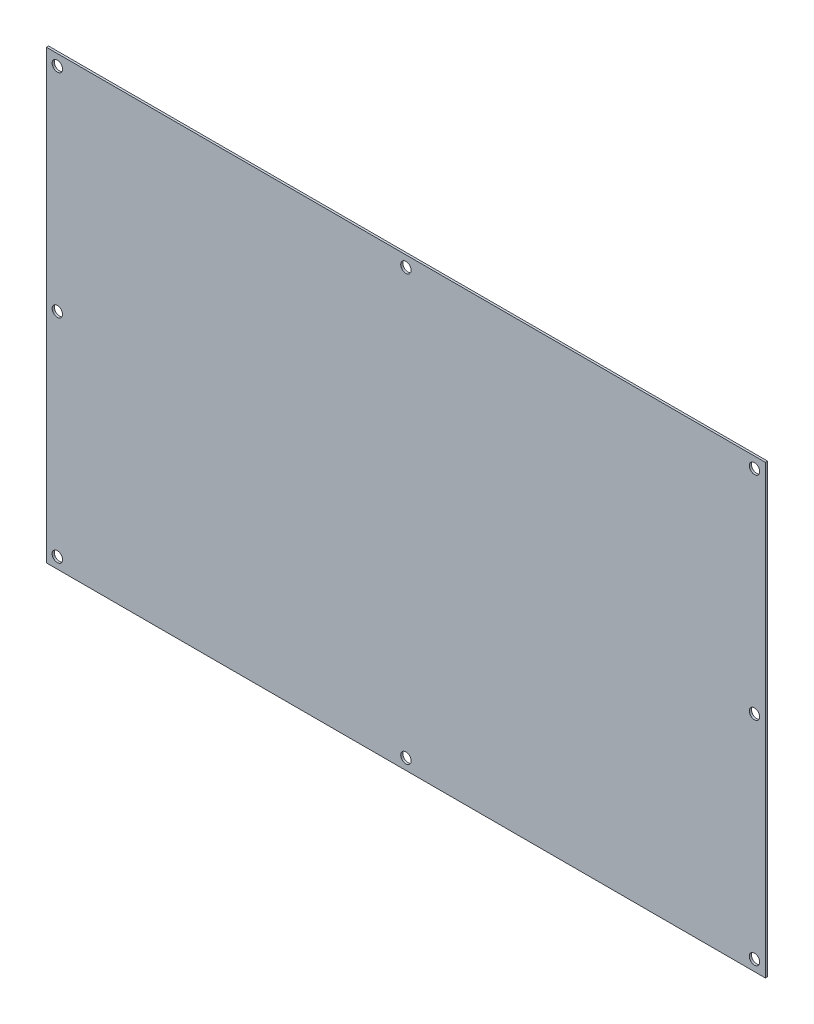
ISO-10303-21;
HEADER;
FILE_DESCRIPTION(('STEP AP214'),'2;1');
FILE_NAME('part.step','',(''),(''),'','','');
FILE_SCHEMA(('AUTOMOTIVE_DESIGN { 1 0 10303 214 1 1 1 1 }'));
ENDSEC;
DATA;
#1=APPLICATION_CONTEXT('core data for automotive mechanical design processes');
#2=APPLICATION_PROTOCOL_DEFINITION('international standard','automotive_design',2000,#1);
#3=PRODUCT_CONTEXT('',#1,'mechanical');
#4=PRODUCT('Part','Part','',(#3));
#5=PRODUCT_RELATED_PRODUCT_CATEGORY('part','',(#4));
#6=PRODUCT_DEFINITION_FORMATION('','',#4);
#7=PRODUCT_DEFINITION_CONTEXT('part definition',#1,'design');
#8=PRODUCT_DEFINITION('design','',#6,#7);
#9=PRODUCT_DEFINITION_SHAPE('','',#8);
#10=(LENGTH_UNIT() NAMED_UNIT(*) SI_UNIT(.MILLI.,.METRE.));
#11=(NAMED_UNIT(*) PLANE_ANGLE_UNIT() SI_UNIT($,.RADIAN.));
#12=(NAMED_UNIT(*) SI_UNIT($,.STERADIAN.) SOLID_ANGLE_UNIT());
#13=UNCERTAINTY_MEASURE_WITH_UNIT(LENGTH_MEASURE(1.E-05),#10,'distance_accuracy_value','');
#14=(GEOMETRIC_REPRESENTATION_CONTEXT(3) GLOBAL_UNCERTAINTY_ASSIGNED_CONTEXT((#13)) GLOBAL_UNIT_ASSIGNED_CONTEXT((#10,
#11,#12)) REPRESENTATION_CONTEXT('',''));
#15=CARTESIAN_POINT('',(0.,0.,0.));
#16=DIRECTION('',(0.,0.,1.));
#17=DIRECTION('',(1.,0.,0.));
#18=AXIS2_PLACEMENT_3D('',#15,#16,#17);
#19=CARTESIAN_POINT('',(278.,-217.,2.));
#20=DIRECTION('',(-1.,0.,0.));
#21=DIRECTION('',(0.,0.,1.));
#22=AXIS2_PLACEMENT_3D('',#19,#20,#21);
#23=PLANE('',#22);
#24=DIRECTION('',(0.,1.,0.));
#25=VECTOR('',#24,1.);
#26=CARTESIAN_POINT('',(278.,-217.,0.));
#27=LINE('',#26,#25);
#28=CARTESIAN_POINT('',(278.,-217.,0.));
#29=VERTEX_POINT('',#28);
#30=CARTESIAN_POINT('',(278.,193.,0.));
#31=VERTEX_POINT('',#30);
#32=EDGE_CURVE('E98',#29,#31,#27,.T.);
#33=ORIENTED_EDGE('',*,*,#32,.T.);
#34=DIRECTION('',(0.,0.,-1.));
#35=VECTOR('',#34,1.);
#36=CARTESIAN_POINT('',(278.,193.,2.));
#37=LINE('',#36,#35);
#38=CARTESIAN_POINT('',(278.,193.,2.));
#39=VERTEX_POINT('',#38);
#40=EDGE_CURVE('E11',#39,#31,#37,.T.);
#41=ORIENTED_EDGE('',*,*,#40,.F.);
#42=DIRECTION('',(0.,1.,0.));
#43=VECTOR('',#42,1.);
#44=CARTESIAN_POINT('',(278.,-217.,2.));
#45=LINE('',#44,#43);
#46=CARTESIAN_POINT('',(278.,-217.,2.));
#47=VERTEX_POINT('',#46);
#48=EDGE_CURVE('E85',#47,#39,#45,.T.);
#49=ORIENTED_EDGE('',*,*,#48,.F.);
#50=DIRECTION('',(0.,0.,-1.));
#51=VECTOR('',#50,1.);
#52=CARTESIAN_POINT('',(278.,-217.,2.));
#53=LINE('',#52,#51);
#54=EDGE_CURVE('E94',#47,#29,#53,.T.);
#55=ORIENTED_EDGE('',*,*,#54,.T.);
#56=EDGE_LOOP('',(#33,#41,#49,#55));
#57=FACE_BOUND('',#56,.T.);
#58=ADVANCED_FACE('F32',(#57),#23,.F.);
#59=CARTESIAN_POINT('',(-382.,193.,2.));
#60=DIRECTION('',(0.,-1.,0.));
#61=DIRECTION('',(0.,0.,-1.));
#62=AXIS2_PLACEMENT_3D('',#59,#60,#61);
#63=PLANE('',#62);
#64=DIRECTION('',(-1.,0.,0.));
#65=VECTOR('',#64,1.);
#66=CARTESIAN_POINT('',(-382.,193.,0.));
#67=LINE('',#66,#65);
#68=CARTESIAN_POINT('',(-382.,193.,0.));
#69=VERTEX_POINT('',#68);
#70=EDGE_CURVE('E89',#31,#69,#67,.T.);
#71=ORIENTED_EDGE('',*,*,#70,.T.);
#72=DIRECTION('',(0.,0.,-1.));
#73=VECTOR('',#72,1.);
#74=CARTESIAN_POINT('',(-382.,193.,2.));
#75=LINE('',#74,#73);
#76=CARTESIAN_POINT('',(-382.,193.,2.));
#77=VERTEX_POINT('',#76);
#78=EDGE_CURVE('E41',#77,#69,#75,.T.);
#79=ORIENTED_EDGE('',*,*,#78,.F.);
#80=DIRECTION('',(-1.,0.,0.));
#81=VECTOR('',#80,1.);
#82=CARTESIAN_POINT('',(-382.,193.,2.));
#83=LINE('',#82,#81);
#84=EDGE_CURVE('E80',#39,#77,#83,.T.);
#85=ORIENTED_EDGE('',*,*,#84,.F.);
#86=ORIENTED_EDGE('',*,*,#40,.T.);
#87=EDGE_LOOP('',(#71,#79,#85,#86));
#88=FACE_BOUND('',#87,.T.);
#89=ADVANCED_FACE('F88',(#88),#63,.F.);
#90=CARTESIAN_POINT('',(-382.,-217.,2.));
#91=DIRECTION('',(1.,0.,0.));
#92=DIRECTION('',(0.,0.,-1.));
#93=AXIS2_PLACEMENT_3D('',#90,#91,#92);
#94=PLANE('',#93);
#95=DIRECTION('',(0.,-1.,0.));
#96=VECTOR('',#95,1.);
#97=CARTESIAN_POINT('',(-382.,-217.,0.));
#98=LINE('',#97,#96);
#99=CARTESIAN_POINT('',(-382.,-217.,0.));
#100=VERTEX_POINT('',#99);
#101=EDGE_CURVE('E67',#69,#100,#98,.T.);
#102=ORIENTED_EDGE('',*,*,#101,.T.);
#103=DIRECTION('',(0.,0.,-1.));
#104=VECTOR('',#103,1.);
#105=CARTESIAN_POINT('',(-382.,-217.,2.));
#106=LINE('',#105,#104);
#107=CARTESIAN_POINT('',(-382.,-217.,2.));
#108=VERTEX_POINT('',#107);
#109=EDGE_CURVE('E90',#108,#100,#106,.T.);
#110=ORIENTED_EDGE('',*,*,#109,.F.);
#111=DIRECTION('',(0.,-1.,0.));
#112=VECTOR('',#111,1.);
#113=CARTESIAN_POINT('',(-382.,-217.,2.));
#114=LINE('',#113,#112);
#115=EDGE_CURVE('E83',#77,#108,#114,.T.);
#116=ORIENTED_EDGE('',*,*,#115,.F.);
#117=ORIENTED_EDGE('',*,*,#78,.T.);
#118=EDGE_LOOP('',(#102,#110,#116,#117));
#119=FACE_BOUND('',#118,.T.);
#120=ADVANCED_FACE('F92',(#119),#94,.F.);
#121=CARTESIAN_POINT('',(-382.,-217.,2.));
#122=DIRECTION('',(0.,1.,0.));
#123=DIRECTION('',(0.,0.,1.));
#124=AXIS2_PLACEMENT_3D('',#121,#122,#123);
#125=PLANE('',#124);
#126=DIRECTION('',(1.,0.,0.));
#127=VECTOR('',#126,1.);
#128=CARTESIAN_POINT('',(-382.,-217.,0.));
#129=LINE('',#128,#127);
#130=EDGE_CURVE('E73',#100,#29,#129,.T.);
#131=ORIENTED_EDGE('',*,*,#130,.T.);
#132=ORIENTED_EDGE('',*,*,#54,.F.);
#133=DIRECTION('',(1.,0.,0.));
#134=VECTOR('',#133,1.);
#135=CARTESIAN_POINT('',(-382.,-217.,2.));
#136=LINE('',#135,#134);
#137=EDGE_CURVE('E50',#108,#47,#136,.T.);
#138=ORIENTED_EDGE('',*,*,#137,.F.);
#139=ORIENTED_EDGE('',*,*,#109,.T.);
#140=EDGE_LOOP('',(#131,#132,#138,#139));
#141=FACE_BOUND('',#140,.T.);
#142=ADVANCED_FACE('F163',(#141),#125,.F.);
#143=CARTESIAN_POINT('',(0.,0.,2.));
#144=DIRECTION('',(0.,0.,-1.));
#145=DIRECTION('',(-1.,0.,0.));
#146=AXIS2_PLACEMENT_3D('',#143,#144,#145);
#147=PLANE('',#146);
#148=CARTESIAN_POINT('',(-372.,-12.,2.));
#149=DIRECTION('',(0.,0.,1.));
#150=DIRECTION('',(1.,0.,0.));
#151=AXIS2_PLACEMENT_3D('',#148,#149,#150);
#152=CIRCLE('',#151,4.76250000000001);
#153=CARTESIAN_POINT('',(-367.2375,-12.,2.));
#154=VERTEX_POINT('',#153);
#155=EDGE_CURVE('E141',#154,#154,#152,.T.);
#156=ORIENTED_EDGE('',*,*,#155,.F.);
#157=EDGE_LOOP('',(#156));
#158=FACE_BOUND('',#157,.T.);
#159=CARTESIAN_POINT('',(268.,-12.,2.));
#160=DIRECTION('',(0.,0.,1.));
#161=DIRECTION('',(-1.,0.,0.));
#162=AXIS2_PLACEMENT_3D('',#159,#160,#161);
#163=CIRCLE('',#162,4.76250000000001);
#164=CARTESIAN_POINT('',(263.2375,-12.,2.));
#165=VERTEX_POINT('',#164);
#166=EDGE_CURVE('E146',#165,#165,#163,.T.);
#167=ORIENTED_EDGE('',*,*,#166,.F.);
#168=EDGE_LOOP('',(#167));
#169=FACE_BOUND('',#168,.T.);
#170=CARTESIAN_POINT('',(-52.,183.,2.));
#171=DIRECTION('',(0.,0.,1.));
#172=DIRECTION('',(1.,0.,0.));
#173=AXIS2_PLACEMENT_3D('',#170,#171,#172);
#174=CIRCLE('',#173,4.765);
#175=CARTESIAN_POINT('',(-47.235,183.,2.));
#176=VERTEX_POINT('',#175);
#177=EDGE_CURVE('E149',#176,#176,#174,.T.);
#178=ORIENTED_EDGE('',*,*,#177,.F.);
#179=EDGE_LOOP('',(#178));
#180=FACE_BOUND('',#179,.T.);
#181=CARTESIAN_POINT('',(-52.,-207.,2.));
#182=DIRECTION('',(0.,0.,1.));
#183=DIRECTION('',(-1.,0.,0.));
#184=AXIS2_PLACEMENT_3D('',#181,#182,#183);
#185=CIRCLE('',#184,4.765);
#186=CARTESIAN_POINT('',(-56.765,-207.,2.));
#187=VERTEX_POINT('',#186);
#188=EDGE_CURVE('E152',#187,#187,#185,.T.);
#189=ORIENTED_EDGE('',*,*,#188,.F.);
#190=EDGE_LOOP('',(#189));
#191=FACE_BOUND('',#190,.T.);
#192=CARTESIAN_POINT('',(-372.,-207.,2.));
#193=DIRECTION('',(0.,0.,1.));
#194=DIRECTION('',(-1.,0.,0.));
#195=AXIS2_PLACEMENT_3D('',#192,#193,#194);
#196=CIRCLE('',#195,4.76500000000001);
#197=CARTESIAN_POINT('',(-376.765,-207.,2.));
#198=VERTEX_POINT('',#197);
#199=EDGE_CURVE('E137',#198,#198,#196,.T.);
#200=ORIENTED_EDGE('',*,*,#199,.F.);
#201=EDGE_LOOP('',(#200));
#202=FACE_BOUND('',#201,.T.);
#203=CARTESIAN_POINT('',(268.,-207.,2.));
#204=DIRECTION('',(0.,0.,1.));
#205=DIRECTION('',(1.,0.,0.));
#206=AXIS2_PLACEMENT_3D('',#203,#204,#205);
#207=CIRCLE('',#206,4.76500000000001);
#208=CARTESIAN_POINT('',(272.765,-207.,2.));
#209=VERTEX_POINT('',#208);
#210=EDGE_CURVE('E140',#209,#209,#207,.T.);
#211=ORIENTED_EDGE('',*,*,#210,.F.);
#212=EDGE_LOOP('',(#211));
#213=FACE_BOUND('',#212,.T.);
#214=CARTESIAN_POINT('',(268.,183.,2.));
#215=DIRECTION('',(0.,0.,1.));
#216=DIRECTION('',(-1.,0.,0.));
#217=AXIS2_PLACEMENT_3D('',#214,#215,#216);
#218=CIRCLE('',#217,4.76500000000001);
#219=CARTESIAN_POINT('',(263.235,183.,2.));
#220=VERTEX_POINT('',#219);
#221=EDGE_CURVE('E114',#220,#220,#218,.T.);
#222=ORIENTED_EDGE('',*,*,#221,.F.);
#223=EDGE_LOOP('',(#222));
#224=FACE_BOUND('',#223,.T.);
#225=CARTESIAN_POINT('',(-372.,183.,2.));
#226=DIRECTION('',(0.,0.,1.));
#227=DIRECTION('',(1.,0.,0.));
#228=AXIS2_PLACEMENT_3D('',#225,#226,#227);
#229=CIRCLE('',#228,4.76500000000001);
#230=CARTESIAN_POINT('',(-367.235,183.,2.));
#231=VERTEX_POINT('',#230);
#232=EDGE_CURVE('E109',#231,#231,#229,.T.);
#233=ORIENTED_EDGE('',*,*,#232,.F.);
#234=EDGE_LOOP('',(#233));
#235=FACE_BOUND('',#234,.T.);
#236=ORIENTED_EDGE('',*,*,#48,.T.);
#237=ORIENTED_EDGE('',*,*,#84,.T.);
#238=ORIENTED_EDGE('',*,*,#115,.T.);
#239=ORIENTED_EDGE('',*,*,#137,.T.);
#240=EDGE_LOOP('',(#236,#237,#238,#239));
#241=FACE_BOUND('',#240,.T.);
#242=ADVANCED_FACE('F81',(#158,#169,#180,#191,#202,#213,#224,#235,#241),#147,.F.);
#243=CARTESIAN_POINT('',(0.,0.,0.));
#244=DIRECTION('',(0.,0.,-1.));
#245=DIRECTION('',(-1.,0.,0.));
#246=AXIS2_PLACEMENT_3D('',#243,#244,#245);
#247=PLANE('',#246);
#248=CARTESIAN_POINT('',(-372.,-12.,0.));
#249=DIRECTION('',(0.,0.,-1.));
#250=DIRECTION('',(-1.,0.,0.));
#251=AXIS2_PLACEMENT_3D('',#248,#249,#250);
#252=CIRCLE('',#251,4.76250000000001);
#253=CARTESIAN_POINT('',(-376.7625,-12.,0.));
#254=VERTEX_POINT('',#253);
#255=EDGE_CURVE('E35',#254,#254,#252,.T.);
#256=ORIENTED_EDGE('',*,*,#255,.F.);
#257=EDGE_LOOP('',(#256));
#258=FACE_BOUND('',#257,.T.);
#259=CARTESIAN_POINT('',(268.,-12.,0.));
#260=DIRECTION('',(0.,0.,-1.));
#261=DIRECTION('',(-1.,0.,0.));
#262=AXIS2_PLACEMENT_3D('',#259,#260,#261);
#263=CIRCLE('',#262,4.76250000000001);
#264=CARTESIAN_POINT('',(263.2375,-12.,0.));
#265=VERTEX_POINT('',#264);
#266=EDGE_CURVE('E125',#265,#265,#263,.T.);
#267=ORIENTED_EDGE('',*,*,#266,.F.);
#268=EDGE_LOOP('',(#267));
#269=FACE_BOUND('',#268,.T.);
#270=CARTESIAN_POINT('',(-52.,183.,0.));
#271=DIRECTION('',(0.,0.,-1.));
#272=DIRECTION('',(-1.,0.,0.));
#273=AXIS2_PLACEMENT_3D('',#270,#271,#272);
#274=CIRCLE('',#273,4.765);
#275=CARTESIAN_POINT('',(-56.765,183.,0.));
#276=VERTEX_POINT('',#275);
#277=EDGE_CURVE('E123',#276,#276,#274,.T.);
#278=ORIENTED_EDGE('',*,*,#277,.F.);
#279=EDGE_LOOP('',(#278));
#280=FACE_BOUND('',#279,.T.);
#281=CARTESIAN_POINT('',(-52.,-207.,0.));
#282=DIRECTION('',(0.,0.,-1.));
#283=DIRECTION('',(-1.,0.,0.));
#284=AXIS2_PLACEMENT_3D('',#281,#282,#283);
#285=CIRCLE('',#284,4.765);
#286=CARTESIAN_POINT('',(-56.765,-207.,0.));
#287=VERTEX_POINT('',#286);
#288=EDGE_CURVE('E120',#287,#287,#285,.T.);
#289=ORIENTED_EDGE('',*,*,#288,.F.);
#290=EDGE_LOOP('',(#289));
#291=FACE_BOUND('',#290,.T.);
#292=CARTESIAN_POINT('',(-372.,-207.,0.));
#293=DIRECTION('',(0.,0.,-1.));
#294=DIRECTION('',(-1.,0.,0.));
#295=AXIS2_PLACEMENT_3D('',#292,#293,#294);
#296=CIRCLE('',#295,4.76500000000001);
#297=CARTESIAN_POINT('',(-376.765,-207.,0.));
#298=VERTEX_POINT('',#297);
#299=EDGE_CURVE('E117',#298,#298,#296,.T.);
#300=ORIENTED_EDGE('',*,*,#299,.F.);
#301=EDGE_LOOP('',(#300));
#302=FACE_BOUND('',#301,.T.);
#303=CARTESIAN_POINT('',(268.,-207.,0.));
#304=DIRECTION('',(0.,0.,-1.));
#305=DIRECTION('',(-1.,0.,0.));
#306=AXIS2_PLACEMENT_3D('',#303,#304,#305);
#307=CIRCLE('',#306,4.76500000000001);
#308=CARTESIAN_POINT('',(263.235,-207.,0.));
#309=VERTEX_POINT('',#308);
#310=EDGE_CURVE('E113',#309,#309,#307,.T.);
#311=ORIENTED_EDGE('',*,*,#310,.F.);
#312=EDGE_LOOP('',(#311));
#313=FACE_BOUND('',#312,.T.);
#314=CARTESIAN_POINT('',(268.,183.,0.));
#315=DIRECTION('',(0.,0.,-1.));
#316=DIRECTION('',(-1.,0.,0.));
#317=AXIS2_PLACEMENT_3D('',#314,#315,#316);
#318=CIRCLE('',#317,4.76500000000001);
#319=CARTESIAN_POINT('',(263.235,183.,0.));
#320=VERTEX_POINT('',#319);
#321=EDGE_CURVE('E110',#320,#320,#318,.T.);
#322=ORIENTED_EDGE('',*,*,#321,.F.);
#323=EDGE_LOOP('',(#322));
#324=FACE_BOUND('',#323,.T.);
#325=CARTESIAN_POINT('',(-372.,183.,0.));
#326=DIRECTION('',(0.,0.,-1.));
#327=DIRECTION('',(-1.,0.,0.));
#328=AXIS2_PLACEMENT_3D('',#325,#326,#327);
#329=CIRCLE('',#328,4.76500000000001);
#330=CARTESIAN_POINT('',(-376.765,183.,0.));
#331=VERTEX_POINT('',#330);
#332=EDGE_CURVE('E101',#331,#331,#329,.T.);
#333=ORIENTED_EDGE('',*,*,#332,.F.);
#334=EDGE_LOOP('',(#333));
#335=FACE_BOUND('',#334,.T.);
#336=ORIENTED_EDGE('',*,*,#32,.F.);
#337=ORIENTED_EDGE('',*,*,#130,.F.);
#338=ORIENTED_EDGE('',*,*,#101,.F.);
#339=ORIENTED_EDGE('',*,*,#70,.F.);
#340=EDGE_LOOP('',(#336,#337,#338,#339));
#341=FACE_BOUND('',#340,.T.);
#342=ADVANCED_FACE('F162',(#258,#269,#280,#291,#302,#313,#324,#335,#341),#247,.T.);
#343=CARTESIAN_POINT('',(-372.,183.,-8.));
#344=DIRECTION('',(0.,0.,1.));
#345=DIRECTION('',(1.,0.,0.));
#346=AXIS2_PLACEMENT_3D('',#343,#344,#345);
#347=CYLINDRICAL_SURFACE('',#346,4.76500000000001);
#348=ORIENTED_EDGE('',*,*,#332,.T.);
#349=EDGE_LOOP('',(#348));
#350=FACE_BOUND('',#349,.T.);
#351=ORIENTED_EDGE('',*,*,#232,.T.);
#352=EDGE_LOOP('',(#351));
#353=FACE_BOUND('',#352,.T.);
#354=ADVANCED_FACE('F178',(#350,#353),#347,.F.);
#355=CARTESIAN_POINT('',(268.,183.,-8.));
#356=DIRECTION('',(0.,0.,1.));
#357=DIRECTION('',(1.,0.,0.));
#358=AXIS2_PLACEMENT_3D('',#355,#356,#357);
#359=CYLINDRICAL_SURFACE('',#358,4.76500000000001);
#360=ORIENTED_EDGE('',*,*,#321,.T.);
#361=EDGE_LOOP('',(#360));
#362=FACE_BOUND('',#361,.T.);
#363=ORIENTED_EDGE('',*,*,#221,.T.);
#364=EDGE_LOOP('',(#363));
#365=FACE_BOUND('',#364,.T.);
#366=ADVANCED_FACE('F175',(#362,#365),#359,.F.);
#367=CARTESIAN_POINT('',(268.,-207.,-8.));
#368=DIRECTION('',(0.,0.,1.));
#369=DIRECTION('',(1.,0.,0.));
#370=AXIS2_PLACEMENT_3D('',#367,#368,#369);
#371=CYLINDRICAL_SURFACE('',#370,4.76500000000001);
#372=ORIENTED_EDGE('',*,*,#310,.T.);
#373=EDGE_LOOP('',(#372));
#374=FACE_BOUND('',#373,.T.);
#375=ORIENTED_EDGE('',*,*,#210,.T.);
#376=EDGE_LOOP('',(#375));
#377=FACE_BOUND('',#376,.T.);
#378=ADVANCED_FACE('F177',(#374,#377),#371,.F.);
#379=CARTESIAN_POINT('',(-372.,-207.,-8.));
#380=DIRECTION('',(0.,0.,1.));
#381=DIRECTION('',(1.,0.,0.));
#382=AXIS2_PLACEMENT_3D('',#379,#380,#381);
#383=CYLINDRICAL_SURFACE('',#382,4.76500000000001);
#384=ORIENTED_EDGE('',*,*,#299,.T.);
#385=EDGE_LOOP('',(#384));
#386=FACE_BOUND('',#385,.T.);
#387=ORIENTED_EDGE('',*,*,#199,.T.);
#388=EDGE_LOOP('',(#387));
#389=FACE_BOUND('',#388,.T.);
#390=ADVANCED_FACE('F185',(#386,#389),#383,.F.);
#391=CARTESIAN_POINT('',(-52.,-207.,-8.));
#392=DIRECTION('',(0.,0.,1.));
#393=DIRECTION('',(1.,0.,0.));
#394=AXIS2_PLACEMENT_3D('',#391,#392,#393);
#395=CYLINDRICAL_SURFACE('',#394,4.765);
#396=ORIENTED_EDGE('',*,*,#288,.T.);
#397=EDGE_LOOP('',(#396));
#398=FACE_BOUND('',#397,.T.);
#399=ORIENTED_EDGE('',*,*,#188,.T.);
#400=EDGE_LOOP('',(#399));
#401=FACE_BOUND('',#400,.T.);
#402=ADVANCED_FACE('F249',(#398,#401),#395,.F.);
#403=CARTESIAN_POINT('',(-52.,183.,-8.));
#404=DIRECTION('',(0.,0.,1.));
#405=DIRECTION('',(1.,0.,0.));
#406=AXIS2_PLACEMENT_3D('',#403,#404,#405);
#407=CYLINDRICAL_SURFACE('',#406,4.765);
#408=ORIENTED_EDGE('',*,*,#277,.T.);
#409=EDGE_LOOP('',(#408));
#410=FACE_BOUND('',#409,.T.);
#411=ORIENTED_EDGE('',*,*,#177,.T.);
#412=EDGE_LOOP('',(#411));
#413=FACE_BOUND('',#412,.T.);
#414=ADVANCED_FACE('F158',(#410,#413),#407,.F.);
#415=CARTESIAN_POINT('',(268.,-12.,-8.));
#416=DIRECTION('',(0.,0.,1.));
#417=DIRECTION('',(1.,0.,0.));
#418=AXIS2_PLACEMENT_3D('',#415,#416,#417);
#419=CYLINDRICAL_SURFACE('',#418,4.76250000000001);
#420=ORIENTED_EDGE('',*,*,#266,.T.);
#421=EDGE_LOOP('',(#420));
#422=FACE_BOUND('',#421,.T.);
#423=ORIENTED_EDGE('',*,*,#166,.T.);
#424=EDGE_LOOP('',(#423));
#425=FACE_BOUND('',#424,.T.);
#426=ADVANCED_FACE('F268',(#422,#425),#419,.F.);
#427=CARTESIAN_POINT('',(-372.,-12.,-8.));
#428=DIRECTION('',(0.,0.,1.));
#429=DIRECTION('',(1.,0.,0.));
#430=AXIS2_PLACEMENT_3D('',#427,#428,#429);
#431=CYLINDRICAL_SURFACE('',#430,4.76250000000001);
#432=ORIENTED_EDGE('',*,*,#255,.T.);
#433=EDGE_LOOP('',(#432));
#434=FACE_BOUND('',#433,.T.);
#435=ORIENTED_EDGE('',*,*,#155,.T.);
#436=EDGE_LOOP('',(#435));
#437=FACE_BOUND('',#436,.T.);
#438=ADVANCED_FACE('F278',(#434,#437),#431,.F.);
#439=CLOSED_SHELL('',(#58,#89,#120,#142,#242,#342,#354,#366,#378,#390,#402,#414,#426,#438));
#440=MANIFOLD_SOLID_BREP('B2',#439);
#441=ADVANCED_BREP_SHAPE_REPRESENTATION('',(#18,#440),#14);
#442=SHAPE_DEFINITION_REPRESENTATION(#9,#441);
ENDSEC;
END-ISO-10303-21;
